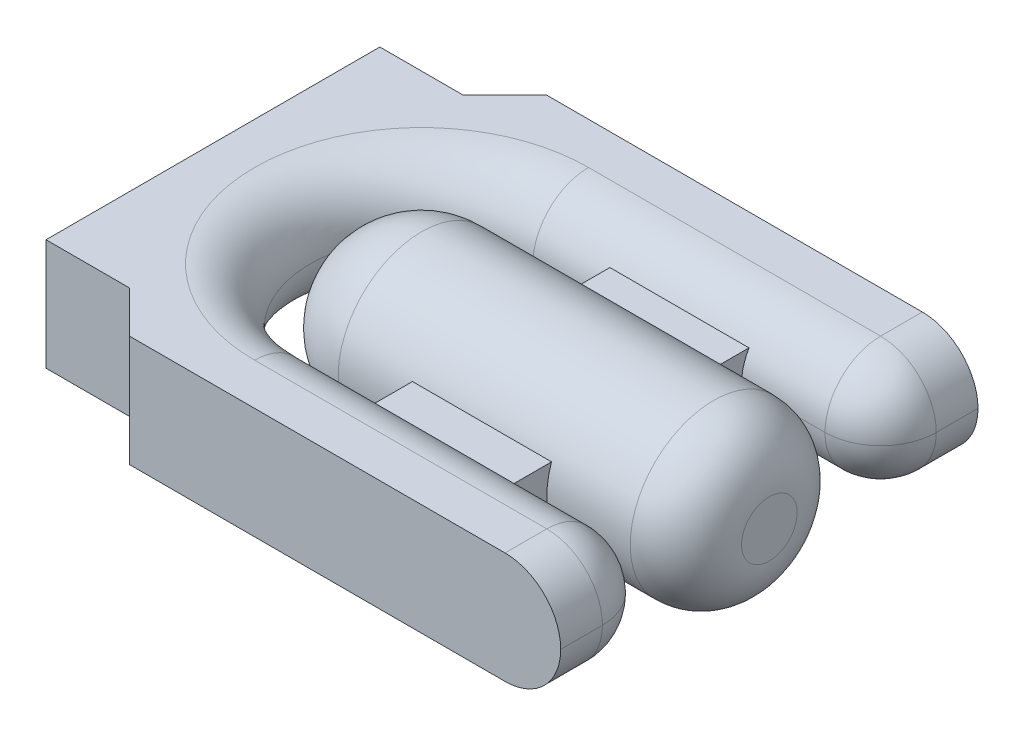
ISO-10303-21;
HEADER;
FILE_DESCRIPTION(('STEP AP214'),'2;1');
FILE_NAME('part.step','',(''),(''),'','','');
FILE_SCHEMA(('AUTOMOTIVE_DESIGN { 1 0 10303 214 1 1 1 1 }'));
ENDSEC;
DATA;
#1=APPLICATION_CONTEXT('core data for automotive mechanical design processes');
#2=APPLICATION_PROTOCOL_DEFINITION('international standard','automotive_design',2000,#1);
#3=PRODUCT_CONTEXT('',#1,'mechanical');
#4=PRODUCT('Part','Part','',(#3));
#5=PRODUCT_RELATED_PRODUCT_CATEGORY('part','',(#4));
#6=PRODUCT_DEFINITION_FORMATION('','',#4);
#7=PRODUCT_DEFINITION_CONTEXT('part definition',#1,'design');
#8=PRODUCT_DEFINITION('design','',#6,#7);
#9=PRODUCT_DEFINITION_SHAPE('','',#8);
#10=(LENGTH_UNIT() NAMED_UNIT(*) SI_UNIT(.MILLI.,.METRE.));
#11=(NAMED_UNIT(*) PLANE_ANGLE_UNIT() SI_UNIT($,.RADIAN.));
#12=(NAMED_UNIT(*) SI_UNIT($,.STERADIAN.) SOLID_ANGLE_UNIT());
#13=UNCERTAINTY_MEASURE_WITH_UNIT(LENGTH_MEASURE(1.E-05),#10,'distance_accuracy_value','');
#14=(GEOMETRIC_REPRESENTATION_CONTEXT(3) GLOBAL_UNCERTAINTY_ASSIGNED_CONTEXT((#13)) GLOBAL_UNIT_ASSIGNED_CONTEXT((#10,
#11,#12)) REPRESENTATION_CONTEXT('',''));
#15=CARTESIAN_POINT('',(0.,0.,0.));
#16=DIRECTION('',(0.,0.,1.));
#17=DIRECTION('',(1.,0.,0.));
#18=AXIS2_PLACEMENT_3D('',#15,#16,#17);
#19=CARTESIAN_POINT('',(0.,-20.,60.));
#20=DIRECTION('',(0.,0.,1.));
#21=DIRECTION('',(1.,0.,0.));
#22=AXIS2_PLACEMENT_3D('',#19,#20,#21);
#23=PLANE('',#22);
#24=DIRECTION('',(0.,1.,0.));
#25=VECTOR('',#24,1.);
#26=CARTESIAN_POINT('',(30.,-20.,60.));
#27=LINE('',#26,#25);
#28=CARTESIAN_POINT('',(30.,-20.,60.));
#29=VERTEX_POINT('',#28);
#30=CARTESIAN_POINT('',(30.,20.,60.));
#31=VERTEX_POINT('',#30);
#32=EDGE_CURVE('E389',#29,#31,#27,.T.);
#33=ORIENTED_EDGE('',*,*,#32,.T.);
#34=DIRECTION('',(1.,0.,0.));
#35=VECTOR('',#34,1.);
#36=CARTESIAN_POINT('',(0.,20.,60.));
#37=LINE('',#36,#35);
#38=CARTESIAN_POINT('',(0.,20.,60.));
#39=VERTEX_POINT('',#38);
#40=EDGE_CURVE('E339',#39,#31,#37,.T.);
#41=ORIENTED_EDGE('',*,*,#40,.F.);
#42=DIRECTION('',(0.,1.,0.));
#43=VECTOR('',#42,1.);
#44=CARTESIAN_POINT('',(0.,-20.,60.));
#45=LINE('',#44,#43);
#46=CARTESIAN_POINT('',(0.,-20.,60.));
#47=VERTEX_POINT('',#46);
#48=EDGE_CURVE('E390',#47,#39,#45,.T.);
#49=ORIENTED_EDGE('',*,*,#48,.F.);
#50=DIRECTION('',(1.,0.,0.));
#51=VECTOR('',#50,1.);
#52=CARTESIAN_POINT('',(0.,-20.,60.));
#53=LINE('',#52,#51);
#54=EDGE_CURVE('E369',#47,#29,#53,.T.);
#55=ORIENTED_EDGE('',*,*,#54,.T.);
#56=EDGE_LOOP('',(#33,#41,#49,#55));
#57=FACE_BOUND('',#56,.T.);
#58=ADVANCED_FACE('F37',(#57),#23,.T.);
#59=CARTESIAN_POINT('',(0.,-20.,-60.));
#60=DIRECTION('',(-1.,0.,0.));
#61=DIRECTION('',(0.,0.,1.));
#62=AXIS2_PLACEMENT_3D('',#59,#60,#61);
#63=PLANE('',#62);
#64=ORIENTED_EDGE('',*,*,#48,.T.);
#65=DIRECTION('',(0.,0.,1.));
#66=VECTOR('',#65,1.);
#67=CARTESIAN_POINT('',(0.,20.,-60.));
#68=LINE('',#67,#66);
#69=CARTESIAN_POINT('',(0.,20.,-60.));
#70=VERTEX_POINT('',#69);
#71=EDGE_CURVE('E366',#70,#39,#68,.T.);
#72=ORIENTED_EDGE('',*,*,#71,.F.);
#73=DIRECTION('',(0.,1.,0.));
#74=VECTOR('',#73,1.);
#75=CARTESIAN_POINT('',(0.,-20.,-60.));
#76=LINE('',#75,#74);
#77=CARTESIAN_POINT('',(0.,-20.,-60.));
#78=VERTEX_POINT('',#77);
#79=EDGE_CURVE('E393',#78,#70,#76,.T.);
#80=ORIENTED_EDGE('',*,*,#79,.F.);
#81=DIRECTION('',(0.,0.,1.));
#82=VECTOR('',#81,1.);
#83=CARTESIAN_POINT('',(0.,-20.,-60.));
#84=LINE('',#83,#82);
#85=EDGE_CURVE('E386',#78,#47,#84,.T.);
#86=ORIENTED_EDGE('',*,*,#85,.T.);
#87=EDGE_LOOP('',(#64,#72,#80,#86));
#88=FACE_BOUND('',#87,.T.);
#89=ADVANCED_FACE('F498',(#88),#63,.T.);
#90=CARTESIAN_POINT('',(0.,-20.,-60.));
#91=DIRECTION('',(0.,0.,-1.));
#92=DIRECTION('',(-1.,0.,0.));
#93=AXIS2_PLACEMENT_3D('',#90,#91,#92);
#94=PLANE('',#93);
#95=ORIENTED_EDGE('',*,*,#79,.T.);
#96=DIRECTION('',(-1.,0.,0.));
#97=VECTOR('',#96,1.);
#98=CARTESIAN_POINT('',(0.,20.,-60.));
#99=LINE('',#98,#97);
#100=CARTESIAN_POINT('',(30.,20.,-60.));
#101=VERTEX_POINT('',#100);
#102=EDGE_CURVE('E363',#101,#70,#99,.T.);
#103=ORIENTED_EDGE('',*,*,#102,.F.);
#104=DIRECTION('',(0.,1.,0.));
#105=VECTOR('',#104,1.);
#106=CARTESIAN_POINT('',(30.,-20.,-60.));
#107=LINE('',#106,#105);
#108=CARTESIAN_POINT('',(30.,-20.,-60.));
#109=VERTEX_POINT('',#108);
#110=EDGE_CURVE('E395',#109,#101,#107,.T.);
#111=ORIENTED_EDGE('',*,*,#110,.F.);
#112=DIRECTION('',(-1.,0.,0.));
#113=VECTOR('',#112,1.);
#114=CARTESIAN_POINT('',(0.,-20.,-60.));
#115=LINE('',#114,#113);
#116=EDGE_CURVE('E383',#109,#78,#115,.T.);
#117=ORIENTED_EDGE('',*,*,#116,.T.);
#118=EDGE_LOOP('',(#95,#103,#111,#117));
#119=FACE_BOUND('',#118,.T.);
#120=ADVANCED_FACE('F504',(#119),#94,.T.);
#121=CARTESIAN_POINT('',(30.,-20.,-60.));
#122=DIRECTION('',(-0.707106781186547,0.,-0.707106781186548));
#123=DIRECTION('',(-0.707106781186548,0.,0.707106781186547));
#124=AXIS2_PLACEMENT_3D('',#121,#122,#123);
#125=PLANE('',#124);
#126=ORIENTED_EDGE('',*,*,#110,.T.);
#127=DIRECTION('',(-0.707106781186548,0.,0.707106781186547));
#128=VECTOR('',#127,1.);
#129=CARTESIAN_POINT('',(30.,20.,-60.));
#130=LINE('',#129,#128);
#131=CARTESIAN_POINT('',(45.,20.,-75.));
#132=VERTEX_POINT('',#131);
#133=EDGE_CURVE('E360',#132,#101,#130,.T.);
#134=ORIENTED_EDGE('',*,*,#133,.F.);
#135=DIRECTION('',(0.,1.,0.));
#136=VECTOR('',#135,1.);
#137=CARTESIAN_POINT('',(45.,-20.,-75.));
#138=LINE('',#137,#136);
#139=CARTESIAN_POINT('',(45.,-20.,-75.));
#140=VERTEX_POINT('',#139);
#141=EDGE_CURVE('E397',#140,#132,#138,.T.);
#142=ORIENTED_EDGE('',*,*,#141,.F.);
#143=DIRECTION('',(-0.707106781186548,0.,0.707106781186547));
#144=VECTOR('',#143,1.);
#145=CARTESIAN_POINT('',(30.,-20.,-60.));
#146=LINE('',#145,#144);
#147=EDGE_CURVE('E380',#140,#109,#146,.T.);
#148=ORIENTED_EDGE('',*,*,#147,.T.);
#149=EDGE_LOOP('',(#126,#134,#142,#148));
#150=FACE_BOUND('',#149,.T.);
#151=ADVANCED_FACE('F559',(#150),#125,.T.);
#152=CARTESIAN_POINT('',(45.,-20.,-75.));
#153=DIRECTION('',(0.,0.,-1.));
#154=DIRECTION('',(-1.,0.,0.));
#155=AXIS2_PLACEMENT_3D('',#152,#153,#154);
#156=PLANE('',#155);
#157=CARTESIAN_POINT('',(180.,0.,-75.));
#158=DIRECTION('',(0.,0.,-1.));
#159=DIRECTION('',(-1.,0.,0.));
#160=AXIS2_PLACEMENT_3D('',#157,#158,#159);
#161=CIRCLE('',#160,20.);
#162=CARTESIAN_POINT('',(180.,20.,-75.));
#163=VERTEX_POINT('',#162);
#164=CARTESIAN_POINT('',(200.,0.,-75.));
#165=VERTEX_POINT('',#164);
#166=EDGE_CURVE('E417',#163,#165,#161,.T.);
#167=ORIENTED_EDGE('',*,*,#166,.T.);
#168=CARTESIAN_POINT('',(180.,0.,-75.));
#169=DIRECTION('',(0.,0.,-1.));
#170=DIRECTION('',(-1.,0.,0.));
#171=AXIS2_PLACEMENT_3D('',#168,#169,#170);
#172=CIRCLE('',#171,20.);
#173=CARTESIAN_POINT('',(180.,-20.,-75.));
#174=VERTEX_POINT('',#173);
#175=EDGE_CURVE('E419',#165,#174,#172,.T.);
#176=ORIENTED_EDGE('',*,*,#175,.T.);
#177=DIRECTION('',(-1.,0.,0.));
#178=VECTOR('',#177,1.);
#179=CARTESIAN_POINT('',(45.,-20.,-75.));
#180=LINE('',#179,#178);
#181=EDGE_CURVE('E378',#174,#140,#180,.T.);
#182=ORIENTED_EDGE('',*,*,#181,.T.);
#183=ORIENTED_EDGE('',*,*,#141,.T.);
#184=DIRECTION('',(-1.,0.,0.));
#185=VECTOR('',#184,1.);
#186=CARTESIAN_POINT('',(45.,20.,-75.));
#187=LINE('',#186,#185);
#188=EDGE_CURVE('E358',#163,#132,#187,.T.);
#189=ORIENTED_EDGE('',*,*,#188,.F.);
#190=EDGE_LOOP('',(#167,#176,#182,#183,#189));
#191=FACE_BOUND('',#190,.T.);
#192=ADVANCED_FACE('F555',(#191),#156,.T.);
#193=CARTESIAN_POINT('',(45.,-20.,75.));
#194=DIRECTION('',(0.,0.,1.));
#195=DIRECTION('',(1.,0.,0.));
#196=AXIS2_PLACEMENT_3D('',#193,#194,#195);
#197=PLANE('',#196);
#198=DIRECTION('',(1.,0.,0.));
#199=VECTOR('',#198,1.);
#200=CARTESIAN_POINT('',(45.,-20.,75.));
#201=LINE('',#200,#199);
#202=CARTESIAN_POINT('',(45.,-20.,75.));
#203=VERTEX_POINT('',#202);
#204=CARTESIAN_POINT('',(180.,-20.,75.));
#205=VERTEX_POINT('',#204);
#206=EDGE_CURVE('E375',#203,#205,#201,.T.);
#207=ORIENTED_EDGE('',*,*,#206,.T.);
#208=CARTESIAN_POINT('',(180.,0.,75.));
#209=DIRECTION('',(0.,0.,1.));
#210=DIRECTION('',(1.,0.,0.));
#211=AXIS2_PLACEMENT_3D('',#208,#209,#210);
#212=CIRCLE('',#211,20.);
#213=CARTESIAN_POINT('',(200.,0.,75.));
#214=VERTEX_POINT('',#213);
#215=EDGE_CURVE('E415',#205,#214,#212,.T.);
#216=ORIENTED_EDGE('',*,*,#215,.T.);
#217=CARTESIAN_POINT('',(180.,0.,75.));
#218=DIRECTION('',(0.,0.,1.));
#219=DIRECTION('',(1.,0.,0.));
#220=AXIS2_PLACEMENT_3D('',#217,#218,#219);
#221=CIRCLE('',#220,20.);
#222=CARTESIAN_POINT('',(180.,20.,75.));
#223=VERTEX_POINT('',#222);
#224=EDGE_CURVE('E413',#214,#223,#221,.T.);
#225=ORIENTED_EDGE('',*,*,#224,.T.);
#226=DIRECTION('',(1.,0.,0.));
#227=VECTOR('',#226,1.);
#228=CARTESIAN_POINT('',(45.,20.,75.));
#229=LINE('',#228,#227);
#230=CARTESIAN_POINT('',(45.,20.,75.));
#231=VERTEX_POINT('',#230);
#232=EDGE_CURVE('E355',#231,#223,#229,.T.);
#233=ORIENTED_EDGE('',*,*,#232,.F.);
#234=DIRECTION('',(0.,1.,0.));
#235=VECTOR('',#234,1.);
#236=CARTESIAN_POINT('',(45.,-20.,75.));
#237=LINE('',#236,#235);
#238=EDGE_CURVE('E400',#203,#231,#237,.T.);
#239=ORIENTED_EDGE('',*,*,#238,.F.);
#240=EDGE_LOOP('',(#207,#216,#225,#233,#239));
#241=FACE_BOUND('',#240,.T.);
#242=ADVANCED_FACE('F572',(#241),#197,.T.);
#243=CARTESIAN_POINT('',(30.,-20.,60.));
#244=DIRECTION('',(-0.707106781186548,0.,0.707106781186548));
#245=DIRECTION('',(0.707106781186548,0.,0.707106781186548));
#246=AXIS2_PLACEMENT_3D('',#243,#244,#245);
#247=PLANE('',#246);
#248=ORIENTED_EDGE('',*,*,#238,.T.);
#249=DIRECTION('',(0.707106781186547,0.,0.707106781186547));
#250=VECTOR('',#249,1.);
#251=CARTESIAN_POINT('',(30.,20.,60.));
#252=LINE('',#251,#250);
#253=EDGE_CURVE('E352',#31,#231,#252,.T.);
#254=ORIENTED_EDGE('',*,*,#253,.F.);
#255=ORIENTED_EDGE('',*,*,#32,.F.);
#256=DIRECTION('',(0.707106781186547,0.,0.707106781186547));
#257=VECTOR('',#256,1.);
#258=CARTESIAN_POINT('',(30.,-20.,60.));
#259=LINE('',#258,#257);
#260=EDGE_CURVE('E372',#29,#203,#259,.T.);
#261=ORIENTED_EDGE('',*,*,#260,.T.);
#262=EDGE_LOOP('',(#248,#254,#255,#261));
#263=FACE_BOUND('',#262,.T.);
#264=ADVANCED_FACE('F509',(#263),#247,.T.);
#265=CARTESIAN_POINT('',(180.,-20.,60.));
#266=DIRECTION('',(0.,1.,0.));
#267=DIRECTION('',(0.,0.,1.));
#268=AXIS2_PLACEMENT_3D('',#265,#266,#267);
#269=PLANE('',#268);
#270=DIRECTION('',(-1.,0.,0.));
#271=VECTOR('',#270,1.);
#272=CARTESIAN_POINT('',(180.,-20.,60.));
#273=LINE('',#272,#271);
#274=CARTESIAN_POINT('',(75.0000000000003,-20.,60.));
#275=VERTEX_POINT('',#274);
#276=CARTESIAN_POINT('',(180.,-20.,60.));
#277=VERTEX_POINT('',#276);
#278=EDGE_CURVE('E408',#275,#277,#273,.F.);
#279=ORIENTED_EDGE('',*,*,#278,.T.);
#280=DIRECTION('',(0.,0.,-1.));
#281=VECTOR('',#280,1.);
#282=CARTESIAN_POINT('',(180.,-20.,75.));
#283=LINE('',#282,#281);
#284=EDGE_CURVE('E410',#277,#205,#283,.F.);
#285=ORIENTED_EDGE('',*,*,#284,.T.);
#286=ORIENTED_EDGE('',*,*,#206,.F.);
#287=ORIENTED_EDGE('',*,*,#260,.F.);
#288=ORIENTED_EDGE('',*,*,#54,.F.);
#289=ORIENTED_EDGE('',*,*,#85,.F.);
#290=ORIENTED_EDGE('',*,*,#116,.F.);
#291=ORIENTED_EDGE('',*,*,#147,.F.);
#292=ORIENTED_EDGE('',*,*,#181,.F.);
#293=DIRECTION('',(0.,0.,-1.));
#294=VECTOR('',#293,1.);
#295=CARTESIAN_POINT('',(180.,-20.,-60.0000000000001));
#296=LINE('',#295,#294);
#297=CARTESIAN_POINT('',(180.,-20.,-60.));
#298=VERTEX_POINT('',#297);
#299=EDGE_CURVE('E406',#174,#298,#296,.F.);
#300=ORIENTED_EDGE('',*,*,#299,.T.);
#301=DIRECTION('',(1.,0.,0.));
#302=VECTOR('',#301,1.);
#303=CARTESIAN_POINT('',(75.0000000000003,-20.,-60.));
#304=LINE('',#303,#302);
#305=CARTESIAN_POINT('',(75.0000000000003,-20.,-60.));
#306=VERTEX_POINT('',#305);
#307=EDGE_CURVE('E404',#298,#306,#304,.F.);
#308=ORIENTED_EDGE('',*,*,#307,.T.);
#309=CARTESIAN_POINT('',(75.,-20.,0.));
#310=DIRECTION('',(0.,1.,0.));
#311=DIRECTION('',(0.,0.,1.));
#312=AXIS2_PLACEMENT_3D('',#309,#310,#311);
#313=CIRCLE('',#312,60.);
#314=EDGE_CURVE('E392',#306,#275,#313,.T.);
#315=ORIENTED_EDGE('',*,*,#314,.T.);
#316=EDGE_LOOP('',(#279,#285,#286,#287,#288,#289,#290,#291,#292,#300,#308,#315));
#317=FACE_BOUND('',#316,.T.);
#318=ADVANCED_FACE('F550',(#317),#269,.F.);
#319=CARTESIAN_POINT('',(180.,20.,60.));
#320=DIRECTION('',(0.,1.,0.));
#321=DIRECTION('',(0.,0.,1.));
#322=AXIS2_PLACEMENT_3D('',#319,#320,#321);
#323=PLANE('',#322);
#324=ORIENTED_EDGE('',*,*,#232,.T.);
#325=DIRECTION('',(0.,0.,-1.));
#326=VECTOR('',#325,1.);
#327=CARTESIAN_POINT('',(180.,20.,60.));
#328=LINE('',#327,#326);
#329=CARTESIAN_POINT('',(180.,20.,60.));
#330=VERTEX_POINT('',#329);
#331=EDGE_CURVE('E429',#223,#330,#328,.T.);
#332=ORIENTED_EDGE('',*,*,#331,.T.);
#333=DIRECTION('',(-1.,0.,0.));
#334=VECTOR('',#333,1.);
#335=CARTESIAN_POINT('',(180.,20.,60.));
#336=LINE('',#335,#334);
#337=CARTESIAN_POINT('',(75.0000000000003,20.,60.));
#338=VERTEX_POINT('',#337);
#339=EDGE_CURVE('E427',#330,#338,#336,.T.);
#340=ORIENTED_EDGE('',*,*,#339,.T.);
#341=CARTESIAN_POINT('',(75.,20.,0.));
#342=DIRECTION('',(0.,1.,0.));
#343=DIRECTION('',(0.,0.,1.));
#344=AXIS2_PLACEMENT_3D('',#341,#342,#343);
#345=CIRCLE('',#344,60.);
#346=CARTESIAN_POINT('',(75.0000000000003,20.,-60.));
#347=VERTEX_POINT('',#346);
#348=EDGE_CURVE('E421',#338,#347,#345,.F.);
#349=ORIENTED_EDGE('',*,*,#348,.T.);
#350=DIRECTION('',(1.,0.,0.));
#351=VECTOR('',#350,1.);
#352=CARTESIAN_POINT('',(180.,20.,-60.));
#353=LINE('',#352,#351);
#354=CARTESIAN_POINT('',(180.,20.,-60.));
#355=VERTEX_POINT('',#354);
#356=EDGE_CURVE('E423',#347,#355,#353,.T.);
#357=ORIENTED_EDGE('',*,*,#356,.T.);
#358=DIRECTION('',(0.,0.,-1.));
#359=VECTOR('',#358,1.);
#360=CARTESIAN_POINT('',(180.,20.,60.));
#361=LINE('',#360,#359);
#362=EDGE_CURVE('E425',#355,#163,#361,.T.);
#363=ORIENTED_EDGE('',*,*,#362,.T.);
#364=ORIENTED_EDGE('',*,*,#188,.T.);
#365=ORIENTED_EDGE('',*,*,#133,.T.);
#366=ORIENTED_EDGE('',*,*,#102,.T.);
#367=ORIENTED_EDGE('',*,*,#71,.T.);
#368=ORIENTED_EDGE('',*,*,#40,.T.);
#369=ORIENTED_EDGE('',*,*,#253,.T.);
#370=EDGE_LOOP('',(#324,#332,#340,#349,#357,#363,#364,#365,#366,#367,#368,#369));
#371=FACE_BOUND('',#370,.T.);
#372=ADVANCED_FACE('F561',(#371),#323,.T.);
#373=CARTESIAN_POINT('',(150.,-9.99999999999999,500000.));
#374=DIRECTION('',(-1.,0.,0.));
#375=DIRECTION('',(0.,0.,1.));
#376=AXIS2_PLACEMENT_3D('',#373,#374,#375);
#377=PLANE('',#376);
#378=CARTESIAN_POINT('',(150.,0.,0.));
#379=DIRECTION('',(-1.,0.,0.));
#380=DIRECTION('',(0.,0.,1.));
#381=AXIS2_PLACEMENT_3D('',#378,#379,#380);
#382=CIRCLE('',#381,30.);
#383=CARTESIAN_POINT('',(150.,-9.99999999999999,-28.2842712474576));
#384=VERTEX_POINT('',#383);
#385=CARTESIAN_POINT('',(150.,10.,-28.2842712474576));
#386=VERTEX_POINT('',#385);
#387=EDGE_CURVE('E333',#384,#386,#382,.F.);
#388=ORIENTED_EDGE('',*,*,#387,.F.);
#389=DIRECTION('',(0.,0.,-1.));
#390=VECTOR('',#389,1.);
#391=CARTESIAN_POINT('',(150.,-9.99999999999999,500000.));
#392=LINE('',#391,#390);
#393=CARTESIAN_POINT('',(150.,-9.99999999999999,-42.6794919243321));
#394=VERTEX_POINT('',#393);
#395=EDGE_CURVE('E337',#384,#394,#392,.T.);
#396=ORIENTED_EDGE('',*,*,#395,.T.);
#397=CARTESIAN_POINT('',(150.,0.,-60.));
#398=DIRECTION('',(-1.,0.,0.));
#399=DIRECTION('',(0.,0.,1.));
#400=AXIS2_PLACEMENT_3D('',#397,#398,#399);
#401=CIRCLE('',#400,20.);
#402=CARTESIAN_POINT('',(150.,0.,-40.));
#403=VERTEX_POINT('',#402);
#404=EDGE_CURVE('E444',#394,#403,#401,.T.);
#405=ORIENTED_EDGE('',*,*,#404,.T.);
#406=CARTESIAN_POINT('',(150.,0.,-60.));
#407=DIRECTION('',(-1.,0.,0.));
#408=DIRECTION('',(0.,0.,1.));
#409=AXIS2_PLACEMENT_3D('',#406,#407,#408);
#410=CIRCLE('',#409,20.);
#411=CARTESIAN_POINT('',(150.,10.,-42.6794919243321));
#412=VERTEX_POINT('',#411);
#413=EDGE_CURVE('E248',#403,#412,#410,.T.);
#414=ORIENTED_EDGE('',*,*,#413,.T.);
#415=DIRECTION('',(0.,0.,-1.));
#416=VECTOR('',#415,1.);
#417=CARTESIAN_POINT('',(150.,10.,500000.));
#418=LINE('',#417,#416);
#419=EDGE_CURVE('E331',#386,#412,#418,.T.);
#420=ORIENTED_EDGE('',*,*,#419,.F.);
#421=EDGE_LOOP('',(#388,#396,#405,#414,#420));
#422=FACE_BOUND('',#421,.T.);
#423=ADVANCED_FACE('F589',(#422),#377,.F.);
#424=CARTESIAN_POINT('',(100.,10.,500000.));
#425=DIRECTION('',(0.,-1.,0.));
#426=DIRECTION('',(0.,0.,-1.));
#427=AXIS2_PLACEMENT_3D('',#424,#425,#426);
#428=PLANE('',#427);
#429=DIRECTION('',(-1.,0.,0.));
#430=VECTOR('',#429,1.);
#431=CARTESIAN_POINT('',(45.,10.,-28.2842712474619));
#432=LINE('',#431,#430);
#433=CARTESIAN_POINT('',(100.,10.,-28.2842712474619));
#434=VERTEX_POINT('',#433);
#435=EDGE_CURVE('E342',#386,#434,#432,.T.);
#436=ORIENTED_EDGE('',*,*,#435,.F.);
#437=ORIENTED_EDGE('',*,*,#419,.T.);
#438=DIRECTION('',(1.,0.,0.));
#439=VECTOR('',#438,1.);
#440=CARTESIAN_POINT('',(150.,10.,-42.6794919243112));
#441=LINE('',#440,#439);
#442=CARTESIAN_POINT('',(100.,10.,-42.6794919243321));
#443=VERTEX_POINT('',#442);
#444=EDGE_CURVE('E47',#412,#443,#441,.F.);
#445=ORIENTED_EDGE('',*,*,#444,.T.);
#446=DIRECTION('',(0.,0.,-1.));
#447=VECTOR('',#446,1.);
#448=CARTESIAN_POINT('',(100.,10.,500000.));
#449=LINE('',#448,#447);
#450=EDGE_CURVE('E55',#434,#443,#449,.T.);
#451=ORIENTED_EDGE('',*,*,#450,.F.);
#452=EDGE_LOOP('',(#436,#437,#445,#451));
#453=FACE_BOUND('',#452,.T.);
#454=ADVANCED_FACE('F594',(#453),#428,.F.);
#455=CARTESIAN_POINT('',(100.,-9.99999999999999,500000.));
#456=DIRECTION('',(0.,1.,0.));
#457=DIRECTION('',(0.,0.,1.));
#458=AXIS2_PLACEMENT_3D('',#455,#456,#457);
#459=PLANE('',#458);
#460=DIRECTION('',(-1.,0.,0.));
#461=VECTOR('',#460,1.);
#462=CARTESIAN_POINT('',(45.,-9.99999999999999,-28.2842712474619));
#463=LINE('',#462,#461);
#464=CARTESIAN_POINT('',(100.,-10.0000000000014,-28.2842712474614));
#465=VERTEX_POINT('',#464);
#466=EDGE_CURVE('E330',#465,#384,#463,.F.);
#467=ORIENTED_EDGE('',*,*,#466,.F.);
#468=DIRECTION('',(0.,0.,-1.));
#469=VECTOR('',#468,1.);
#470=CARTESIAN_POINT('',(100.,-9.99999999999999,500000.));
#471=LINE('',#470,#469);
#472=CARTESIAN_POINT('',(100.,-9.99999999999999,-42.6794919243321));
#473=VERTEX_POINT('',#472);
#474=EDGE_CURVE('E335',#465,#473,#471,.T.);
#475=ORIENTED_EDGE('',*,*,#474,.T.);
#476=DIRECTION('',(-1.,0.,0.));
#477=VECTOR('',#476,1.);
#478=CARTESIAN_POINT('',(100.,-9.99999999999999,-42.6794919243112));
#479=LINE('',#478,#477);
#480=EDGE_CURVE('E441',#473,#394,#479,.F.);
#481=ORIENTED_EDGE('',*,*,#480,.T.);
#482=ORIENTED_EDGE('',*,*,#395,.F.);
#483=EDGE_LOOP('',(#467,#475,#481,#482));
#484=FACE_BOUND('',#483,.T.);
#485=ADVANCED_FACE('F591',(#484),#459,.F.);
#486=CARTESIAN_POINT('',(100.,-9.99999999999999,500000.));
#487=DIRECTION('',(1.,0.,0.));
#488=DIRECTION('',(0.,0.,-1.));
#489=AXIS2_PLACEMENT_3D('',#486,#487,#488);
#490=PLANE('',#489);
#491=CARTESIAN_POINT('',(100.,0.,0.));
#492=DIRECTION('',(1.,0.,0.));
#493=DIRECTION('',(0.,0.,-1.));
#494=AXIS2_PLACEMENT_3D('',#491,#492,#493);
#495=CIRCLE('',#494,30.);
#496=EDGE_CURVE('E345',#434,#465,#495,.F.);
#497=ORIENTED_EDGE('',*,*,#496,.F.);
#498=ORIENTED_EDGE('',*,*,#450,.T.);
#499=CARTESIAN_POINT('',(100.,0.,-60.));
#500=DIRECTION('',(1.,0.,0.));
#501=DIRECTION('',(0.,0.,-1.));
#502=AXIS2_PLACEMENT_3D('',#499,#500,#501);
#503=CIRCLE('',#502,20.);
#504=CARTESIAN_POINT('',(100.,0.,-40.));
#505=VERTEX_POINT('',#504);
#506=EDGE_CURVE('E11',#443,#505,#503,.T.);
#507=ORIENTED_EDGE('',*,*,#506,.T.);
#508=CARTESIAN_POINT('',(100.,0.,-60.));
#509=DIRECTION('',(1.,0.,0.));
#510=DIRECTION('',(0.,0.,-1.));
#511=AXIS2_PLACEMENT_3D('',#508,#509,#510);
#512=CIRCLE('',#511,20.);
#513=EDGE_CURVE('E438',#505,#473,#512,.T.);
#514=ORIENTED_EDGE('',*,*,#513,.T.);
#515=ORIENTED_EDGE('',*,*,#474,.F.);
#516=EDGE_LOOP('',(#497,#498,#507,#514,#515));
#517=FACE_BOUND('',#516,.T.);
#518=ADVANCED_FACE('F590',(#517),#490,.F.);
#519=CARTESIAN_POINT('',(45.,0.,0.));
#520=DIRECTION('',(-1.,0.,0.));
#521=DIRECTION('',(0.,-1.,0.));
#522=AXIS2_PLACEMENT_3D('',#519,#520,#521);
#523=CYLINDRICAL_SURFACE('',#522,30.);
#524=CARTESIAN_POINT('',(100.,0.,0.));
#525=DIRECTION('',(-1.,0.,0.));
#526=DIRECTION('',(0.,0.,1.));
#527=AXIS2_PLACEMENT_3D('',#524,#525,#526);
#528=CIRCLE('',#527,30.);
#529=CARTESIAN_POINT('',(100.,10.,28.2842712474576));
#530=VERTEX_POINT('',#529);
#531=CARTESIAN_POINT('',(100.,-9.99999999999999,28.2842712474619));
#532=VERTEX_POINT('',#531);
#533=EDGE_CURVE('E310',#530,#532,#528,.F.);
#534=ORIENTED_EDGE('',*,*,#533,.F.);
#535=DIRECTION('',(-1.,0.,0.));
#536=VECTOR('',#535,1.);
#537=CARTESIAN_POINT('',(45.,10.,28.2842712474619));
#538=LINE('',#537,#536);
#539=CARTESIAN_POINT('',(150.,10.,28.2842712474576));
#540=VERTEX_POINT('',#539);
#541=EDGE_CURVE('E315',#540,#530,#538,.T.);
#542=ORIENTED_EDGE('',*,*,#541,.F.);
#543=CARTESIAN_POINT('',(150.,0.,0.));
#544=DIRECTION('',(1.,0.,0.));
#545=DIRECTION('',(0.,0.,-1.));
#546=AXIS2_PLACEMENT_3D('',#543,#544,#545);
#547=CIRCLE('',#546,30.);
#548=CARTESIAN_POINT('',(150.,-9.99999999999999,28.2842712474576));
#549=VERTEX_POINT('',#548);
#550=EDGE_CURVE('E228',#549,#540,#547,.F.);
#551=ORIENTED_EDGE('',*,*,#550,.F.);
#552=DIRECTION('',(-1.,0.,0.));
#553=VECTOR('',#552,1.);
#554=CARTESIAN_POINT('',(45.,-9.99999999999999,28.2842712474619));
#555=LINE('',#554,#553);
#556=EDGE_CURVE('E94',#532,#549,#555,.F.);
#557=ORIENTED_EDGE('',*,*,#556,.F.);
#558=EDGE_LOOP('',(#534,#542,#551,#557));
#559=FACE_BOUND('',#558,.T.);
#560=CARTESIAN_POINT('',(75.,0.,0.));
#561=DIRECTION('',(-1.,0.,0.));
#562=DIRECTION('',(0.,-1.,0.));
#563=AXIS2_PLACEMENT_3D('',#560,#561,#562);
#564=CIRCLE('',#563,30.);
#565=CARTESIAN_POINT('',(75.,-30.,0.));
#566=VERTEX_POINT('',#565);
#567=EDGE_CURVE('E231',#566,#566,#564,.T.);
#568=ORIENTED_EDGE('',*,*,#567,.F.);
#569=EDGE_LOOP('',(#568));
#570=FACE_BOUND('',#569,.T.);
#571=CARTESIAN_POINT('',(180.,0.,0.));
#572=DIRECTION('',(-1.,0.,0.));
#573=DIRECTION('',(0.,-1.,0.));
#574=AXIS2_PLACEMENT_3D('',#571,#572,#573);
#575=CIRCLE('',#574,30.);
#576=CARTESIAN_POINT('',(180.,-30.,0.));
#577=VERTEX_POINT('',#576);
#578=EDGE_CURVE('E324',#577,#577,#575,.T.);
#579=ORIENTED_EDGE('',*,*,#578,.T.);
#580=EDGE_LOOP('',(#579));
#581=FACE_BOUND('',#580,.T.);
#582=ORIENTED_EDGE('',*,*,#466,.T.);
#583=ORIENTED_EDGE('',*,*,#387,.T.);
#584=ORIENTED_EDGE('',*,*,#435,.T.);
#585=ORIENTED_EDGE('',*,*,#496,.T.);
#586=EDGE_LOOP('',(#582,#583,#584,#585));
#587=FACE_BOUND('',#586,.T.);
#588=ADVANCED_FACE('F481',(#559,#570,#581,#587),#523,.T.);
#589=CARTESIAN_POINT('',(75.,0.,0.));
#590=DIRECTION('',(-1.,0.,0.));
#591=DIRECTION('',(0.,1.,0.));
#592=AXIS2_PLACEMENT_3D('',#589,#590,#591);
#593=SPHERICAL_SURFACE('',#592,30.);
#594=ORIENTED_EDGE('',*,*,#567,.T.);
#595=EDGE_LOOP('',(#594));
#596=FACE_BOUND('',#595,.T.);
#597=ADVANCED_FACE('F604',(#596),#593,.T.);
#598=CARTESIAN_POINT('',(200.,9.99999999999986,0.));
#599=DIRECTION('',(-1.,0.,0.));
#600=DIRECTION('',(0.,-1.,0.));
#601=AXIS2_PLACEMENT_3D('',#598,#599,#600);
#602=PLANE('',#601);
#603=CARTESIAN_POINT('',(200.,0.,0.));
#604=DIRECTION('',(-1.,0.,0.));
#605=DIRECTION('',(0.,-1.,0.));
#606=AXIS2_PLACEMENT_3D('',#603,#604,#605);
#607=CIRCLE('',#606,9.99999999999986);
#608=CARTESIAN_POINT('',(200.,-9.99999999999986,0.));
#609=VERTEX_POINT('',#608);
#610=EDGE_CURVE('E327',#609,#609,#607,.T.);
#611=ORIENTED_EDGE('',*,*,#610,.F.);
#612=EDGE_LOOP('',(#611));
#613=FACE_BOUND('',#612,.T.);
#614=ADVANCED_FACE('F494',(#613),#602,.F.);
#615=CARTESIAN_POINT('',(180.,0.,0.));
#616=DIRECTION('',(-1.,0.,0.));
#617=DIRECTION('',(0.,-1.,0.));
#618=AXIS2_PLACEMENT_3D('',#615,#616,#617);
#619=DEGENERATE_TOROIDAL_SURFACE('',#618,10.,20.,.T.);
#620=ORIENTED_EDGE('',*,*,#578,.F.);
#621=EDGE_LOOP('',(#620));
#622=FACE_BOUND('',#621,.T.);
#623=ORIENTED_EDGE('',*,*,#610,.T.);
#624=EDGE_LOOP('',(#623));
#625=FACE_BOUND('',#624,.T.);
#626=ADVANCED_FACE('F486',(#622,#625),#619,.T.);
#627=CARTESIAN_POINT('',(100.,10.,-500000.));
#628=DIRECTION('',(0.,1.,0.));
#629=DIRECTION('',(0.,0.,1.));
#630=AXIS2_PLACEMENT_3D('',#627,#628,#629);
#631=PLANE('',#630);
#632=DIRECTION('',(0.,0.,1.));
#633=VECTOR('',#632,1.);
#634=CARTESIAN_POINT('',(150.,10.,-500000.));
#635=LINE('',#634,#633);
#636=CARTESIAN_POINT('',(150.,10.,42.6794919243321));
#637=VERTEX_POINT('',#636);
#638=EDGE_CURVE('E220',#540,#637,#635,.T.);
#639=ORIENTED_EDGE('',*,*,#638,.F.);
#640=ORIENTED_EDGE('',*,*,#541,.T.);
#641=DIRECTION('',(0.,0.,1.));
#642=VECTOR('',#641,1.);
#643=CARTESIAN_POINT('',(100.,10.,-500000.));
#644=LINE('',#643,#642);
#645=CARTESIAN_POINT('',(100.,10.,42.6794919243321));
#646=VERTEX_POINT('',#645);
#647=EDGE_CURVE('E232',#530,#646,#644,.T.);
#648=ORIENTED_EDGE('',*,*,#647,.T.);
#649=DIRECTION('',(-1.,0.,0.));
#650=VECTOR('',#649,1.);
#651=CARTESIAN_POINT('',(100.,10.,42.6794919243112));
#652=LINE('',#651,#650);
#653=EDGE_CURVE('E235',#646,#637,#652,.F.);
#654=ORIENTED_EDGE('',*,*,#653,.T.);
#655=EDGE_LOOP('',(#639,#640,#648,#654));
#656=FACE_BOUND('',#655,.T.);
#657=ADVANCED_FACE('F236',(#656),#631,.T.);
#658=CARTESIAN_POINT('',(150.,-9.99999999999999,-500000.));
#659=DIRECTION('',(1.,0.,0.));
#660=DIRECTION('',(0.,0.,-1.));
#661=AXIS2_PLACEMENT_3D('',#658,#659,#660);
#662=PLANE('',#661);
#663=DIRECTION('',(0.,0.,1.));
#664=VECTOR('',#663,1.);
#665=CARTESIAN_POINT('',(150.,-9.99999999999999,-500000.));
#666=LINE('',#665,#664);
#667=CARTESIAN_POINT('',(150.,-9.99999999999999,42.6794919243321));
#668=VERTEX_POINT('',#667);
#669=EDGE_CURVE('E317',#549,#668,#666,.T.);
#670=ORIENTED_EDGE('',*,*,#669,.F.);
#671=ORIENTED_EDGE('',*,*,#550,.T.);
#672=ORIENTED_EDGE('',*,*,#638,.T.);
#673=CARTESIAN_POINT('',(150.,0.,60.));
#674=DIRECTION('',(1.,0.,0.));
#675=DIRECTION('',(0.,0.,-1.));
#676=AXIS2_PLACEMENT_3D('',#673,#674,#675);
#677=CIRCLE('',#676,20.);
#678=CARTESIAN_POINT('',(150.,0.,40.));
#679=VERTEX_POINT('',#678);
#680=EDGE_CURVE('E225',#637,#679,#677,.F.);
#681=ORIENTED_EDGE('',*,*,#680,.T.);
#682=CARTESIAN_POINT('',(150.,0.,60.));
#683=DIRECTION('',(1.,0.,0.));
#684=DIRECTION('',(0.,0.,-1.));
#685=AXIS2_PLACEMENT_3D('',#682,#683,#684);
#686=CIRCLE('',#685,20.);
#687=EDGE_CURVE('E431',#679,#668,#686,.F.);
#688=ORIENTED_EDGE('',*,*,#687,.T.);
#689=EDGE_LOOP('',(#670,#671,#672,#681,#688));
#690=FACE_BOUND('',#689,.T.);
#691=ADVANCED_FACE('F222',(#690),#662,.T.);
#692=CARTESIAN_POINT('',(100.,-9.99999999999999,-500000.));
#693=DIRECTION('',(-1.,0.,0.));
#694=DIRECTION('',(0.,0.,1.));
#695=AXIS2_PLACEMENT_3D('',#692,#693,#694);
#696=PLANE('',#695);
#697=ORIENTED_EDGE('',*,*,#647,.F.);
#698=ORIENTED_EDGE('',*,*,#533,.T.);
#699=DIRECTION('',(0.,0.,1.));
#700=VECTOR('',#699,1.);
#701=CARTESIAN_POINT('',(100.,-9.99999999999999,-500000.));
#702=LINE('',#701,#700);
#703=CARTESIAN_POINT('',(100.,-9.99999999999999,42.6794919243321));
#704=VERTEX_POINT('',#703);
#705=EDGE_CURVE('E319',#532,#704,#702,.T.);
#706=ORIENTED_EDGE('',*,*,#705,.T.);
#707=CARTESIAN_POINT('',(100.,0.,60.));
#708=DIRECTION('',(-1.,0.,0.));
#709=DIRECTION('',(0.,0.,1.));
#710=AXIS2_PLACEMENT_3D('',#707,#708,#709);
#711=CIRCLE('',#710,20.);
#712=CARTESIAN_POINT('',(100.,0.,40.));
#713=VERTEX_POINT('',#712);
#714=EDGE_CURVE('E436',#704,#713,#711,.F.);
#715=ORIENTED_EDGE('',*,*,#714,.T.);
#716=CARTESIAN_POINT('',(100.,0.,60.));
#717=DIRECTION('',(-1.,0.,0.));
#718=DIRECTION('',(0.,0.,1.));
#719=AXIS2_PLACEMENT_3D('',#716,#717,#718);
#720=CIRCLE('',#719,20.);
#721=EDGE_CURVE('E241',#713,#646,#720,.F.);
#722=ORIENTED_EDGE('',*,*,#721,.T.);
#723=EDGE_LOOP('',(#697,#698,#706,#715,#722));
#724=FACE_BOUND('',#723,.T.);
#725=ADVANCED_FACE('F446',(#724),#696,.T.);
#726=CARTESIAN_POINT('',(100.,-9.99999999999999,-500000.));
#727=DIRECTION('',(0.,-1.,0.));
#728=DIRECTION('',(0.,0.,-1.));
#729=AXIS2_PLACEMENT_3D('',#726,#727,#728);
#730=PLANE('',#729);
#731=ORIENTED_EDGE('',*,*,#705,.F.);
#732=ORIENTED_EDGE('',*,*,#556,.T.);
#733=ORIENTED_EDGE('',*,*,#669,.T.);
#734=DIRECTION('',(1.,0.,0.));
#735=VECTOR('',#734,1.);
#736=CARTESIAN_POINT('',(150.,-9.99999999999999,42.6794919243112));
#737=LINE('',#736,#735);
#738=EDGE_CURVE('E433',#668,#704,#737,.F.);
#739=ORIENTED_EDGE('',*,*,#738,.T.);
#740=EDGE_LOOP('',(#731,#732,#733,#739));
#741=FACE_BOUND('',#740,.T.);
#742=ADVANCED_FACE('F483',(#741),#730,.T.);
#743=CARTESIAN_POINT('',(180.,0.,60.));
#744=DIRECTION('',(0.,0.,-1.));
#745=DIRECTION('',(-1.,0.,0.));
#746=AXIS2_PLACEMENT_3D('',#743,#744,#745);
#747=CYLINDRICAL_SURFACE('',#746,20.);
#748=CARTESIAN_POINT('',(180.,0.,-60.0000000000001));
#749=DIRECTION('',(0.,0.,1.));
#750=DIRECTION('',(1.,0.,0.));
#751=AXIS2_PLACEMENT_3D('',#748,#749,#750);
#752=CIRCLE('',#751,20.);
#753=CARTESIAN_POINT('',(200.,0.,-60.0000000000001));
#754=VERTEX_POINT('',#753);
#755=EDGE_CURVE('E41',#754,#355,#752,.T.);
#756=ORIENTED_EDGE('',*,*,#755,.F.);
#757=DIRECTION('',(0.,0.,-1.));
#758=VECTOR('',#757,1.);
#759=CARTESIAN_POINT('',(200.,0.,-75.));
#760=LINE('',#759,#758);
#761=EDGE_CURVE('E305',#165,#754,#760,.F.);
#762=ORIENTED_EDGE('',*,*,#761,.F.);
#763=ORIENTED_EDGE('',*,*,#166,.F.);
#764=ORIENTED_EDGE('',*,*,#362,.F.);
#765=EDGE_LOOP('',(#756,#762,#763,#764));
#766=FACE_BOUND('',#765,.T.);
#767=ADVANCED_FACE('F39',(#766),#747,.T.);
#768=CARTESIAN_POINT('',(180.,0.,-60.));
#769=DIRECTION('',(0.,1.,0.));
#770=DIRECTION('',(0.,0.,1.));
#771=AXIS2_PLACEMENT_3D('',#768,#769,#770);
#772=SPHERICAL_SURFACE('',#771,20.);
#773=CARTESIAN_POINT('',(180.,0.,-60.));
#774=DIRECTION('',(0.,1.,0.));
#775=DIRECTION('',(0.,0.,1.));
#776=AXIS2_PLACEMENT_3D('',#773,#774,#775);
#777=CIRCLE('',#776,20.);
#778=CARTESIAN_POINT('',(180.,0.,-40.));
#779=VERTEX_POINT('',#778);
#780=EDGE_CURVE('E303',#754,#779,#777,.F.);
#781=ORIENTED_EDGE('',*,*,#780,.F.);
#782=ORIENTED_EDGE('',*,*,#755,.T.);
#783=CARTESIAN_POINT('',(180.,0.,-60.));
#784=DIRECTION('',(-1.,0.,0.));
#785=DIRECTION('',(0.,0.,1.));
#786=AXIS2_PLACEMENT_3D('',#783,#784,#785);
#787=CIRCLE('',#786,20.);
#788=EDGE_CURVE('E79',#779,#355,#787,.T.);
#789=ORIENTED_EDGE('',*,*,#788,.F.);
#790=EDGE_LOOP('',(#781,#782,#789));
#791=FACE_BOUND('',#790,.T.);
#792=ADVANCED_FACE('F491',(#791),#772,.T.);
#793=CARTESIAN_POINT('',(180.,0.,-75.));
#794=DIRECTION('',(0.,0.,1.));
#795=DIRECTION('',(1.,0.,0.));
#796=AXIS2_PLACEMENT_3D('',#793,#794,#795);
#797=CYLINDRICAL_SURFACE('',#796,20.);
#798=ORIENTED_EDGE('',*,*,#175,.F.);
#799=ORIENTED_EDGE('',*,*,#761,.T.);
#800=CARTESIAN_POINT('',(180.,0.,-60.0000000000001));
#801=DIRECTION('',(0.,0.,1.));
#802=DIRECTION('',(1.,0.,0.));
#803=AXIS2_PLACEMENT_3D('',#800,#801,#802);
#804=CIRCLE('',#803,20.);
#805=EDGE_CURVE('E300',#298,#754,#804,.T.);
#806=ORIENTED_EDGE('',*,*,#805,.F.);
#807=ORIENTED_EDGE('',*,*,#299,.F.);
#808=EDGE_LOOP('',(#798,#799,#806,#807));
#809=FACE_BOUND('',#808,.T.);
#810=ADVANCED_FACE('F538',(#809),#797,.T.);
#811=CARTESIAN_POINT('',(180.,0.,-60.));
#812=DIRECTION('',(1.,0.,0.));
#813=DIRECTION('',(0.,0.,-1.));
#814=AXIS2_PLACEMENT_3D('',#811,#812,#813);
#815=CYLINDRICAL_SURFACE('',#814,20.);
#816=ORIENTED_EDGE('',*,*,#788,.T.);
#817=ORIENTED_EDGE('',*,*,#356,.F.);
#818=CARTESIAN_POINT('',(75.0000000000003,0.,-60.));
#819=DIRECTION('',(-1.,0.,0.));
#820=DIRECTION('',(0.,0.,1.));
#821=AXIS2_PLACEMENT_3D('',#818,#819,#820);
#822=CIRCLE('',#821,20.);
#823=CARTESIAN_POINT('',(75.0000000000003,0.,-40.));
#824=VERTEX_POINT('',#823);
#825=EDGE_CURVE('E297',#824,#347,#822,.T.);
#826=ORIENTED_EDGE('',*,*,#825,.F.);
#827=DIRECTION('',(1.,0.,0.));
#828=VECTOR('',#827,1.);
#829=CARTESIAN_POINT('',(180.,0.,-40.));
#830=LINE('',#829,#828);
#831=EDGE_CURVE('E294',#505,#824,#830,.F.);
#832=ORIENTED_EDGE('',*,*,#831,.F.);
#833=ORIENTED_EDGE('',*,*,#506,.F.);
#834=ORIENTED_EDGE('',*,*,#444,.F.);
#835=ORIENTED_EDGE('',*,*,#413,.F.);
#836=DIRECTION('',(1.,0.,0.));
#837=VECTOR('',#836,1.);
#838=CARTESIAN_POINT('',(180.,0.,-40.));
#839=LINE('',#838,#837);
#840=EDGE_CURVE('E291',#779,#403,#839,.F.);
#841=ORIENTED_EDGE('',*,*,#840,.F.);
#842=EDGE_LOOP('',(#816,#817,#826,#832,#833,#834,#835,#841));
#843=FACE_BOUND('',#842,.T.);
#844=ADVANCED_FACE('F534',(#843),#815,.T.);
#845=CARTESIAN_POINT('',(180.,0.,-60.));
#846=DIRECTION('',(0.,1.,0.));
#847=DIRECTION('',(0.,0.,1.));
#848=AXIS2_PLACEMENT_3D('',#845,#846,#847);
#849=SPHERICAL_SURFACE('',#848,20.);
#850=ORIENTED_EDGE('',*,*,#805,.T.);
#851=ORIENTED_EDGE('',*,*,#780,.T.);
#852=CARTESIAN_POINT('',(180.,0.,-60.));
#853=DIRECTION('',(-1.,0.,0.));
#854=DIRECTION('',(0.,0.,1.));
#855=AXIS2_PLACEMENT_3D('',#852,#853,#854);
#856=CIRCLE('',#855,20.);
#857=EDGE_CURVE('E288',#298,#779,#856,.T.);
#858=ORIENTED_EDGE('',*,*,#857,.F.);
#859=EDGE_LOOP('',(#850,#851,#858));
#860=FACE_BOUND('',#859,.T.);
#861=ADVANCED_FACE('F531',(#860),#849,.T.);
#862=CARTESIAN_POINT('',(75.,0.,0.));
#863=DIRECTION('',(0.,1.,0.));
#864=DIRECTION('',(0.,0.,1.));
#865=AXIS2_PLACEMENT_3D('',#862,#863,#864);
#866=TOROIDAL_SURFACE('',#865,60.,20.);
#867=ORIENTED_EDGE('',*,*,#825,.T.);
#868=ORIENTED_EDGE('',*,*,#348,.F.);
#869=CARTESIAN_POINT('',(75.0000000000004,0.,60.));
#870=DIRECTION('',(1.,0.,0.));
#871=DIRECTION('',(0.,0.,-1.));
#872=AXIS2_PLACEMENT_3D('',#869,#870,#871);
#873=CIRCLE('',#872,20.);
#874=CARTESIAN_POINT('',(75.0000000000003,0.,40.));
#875=VERTEX_POINT('',#874);
#876=EDGE_CURVE('E286',#875,#338,#873,.T.);
#877=ORIENTED_EDGE('',*,*,#876,.F.);
#878=CARTESIAN_POINT('',(75.,0.,0.));
#879=DIRECTION('',(0.,1.,0.));
#880=DIRECTION('',(0.,0.,1.));
#881=AXIS2_PLACEMENT_3D('',#878,#879,#880);
#882=CIRCLE('',#881,40.);
#883=EDGE_CURVE('E283',#824,#875,#882,.T.);
#884=ORIENTED_EDGE('',*,*,#883,.F.);
#885=EDGE_LOOP('',(#867,#868,#877,#884));
#886=FACE_BOUND('',#885,.T.);
#887=ADVANCED_FACE('F462',(#886),#866,.T.);
#888=CARTESIAN_POINT('',(180.,0.,-60.));
#889=DIRECTION('',(-1.,0.,0.));
#890=DIRECTION('',(0.,0.,1.));
#891=AXIS2_PLACEMENT_3D('',#888,#889,#890);
#892=CYLINDRICAL_SURFACE('',#891,20.);
#893=ORIENTED_EDGE('',*,*,#513,.F.);
#894=ORIENTED_EDGE('',*,*,#831,.T.);
#895=CARTESIAN_POINT('',(75.0000000000003,0.,-60.));
#896=DIRECTION('',(-1.,0.,0.));
#897=DIRECTION('',(0.,0.,1.));
#898=AXIS2_PLACEMENT_3D('',#895,#896,#897);
#899=CIRCLE('',#898,20.);
#900=EDGE_CURVE('E280',#306,#824,#899,.T.);
#901=ORIENTED_EDGE('',*,*,#900,.F.);
#902=ORIENTED_EDGE('',*,*,#307,.F.);
#903=ORIENTED_EDGE('',*,*,#857,.T.);
#904=ORIENTED_EDGE('',*,*,#840,.T.);
#905=ORIENTED_EDGE('',*,*,#404,.F.);
#906=ORIENTED_EDGE('',*,*,#480,.F.);
#907=EDGE_LOOP('',(#893,#894,#901,#902,#903,#904,#905,#906));
#908=FACE_BOUND('',#907,.T.);
#909=ADVANCED_FACE('F525',(#908),#892,.T.);
#910=CARTESIAN_POINT('',(180.,0.,60.));
#911=DIRECTION('',(-1.,0.,0.));
#912=DIRECTION('',(0.,0.,1.));
#913=AXIS2_PLACEMENT_3D('',#910,#911,#912);
#914=CYLINDRICAL_SURFACE('',#913,20.);
#915=ORIENTED_EDGE('',*,*,#876,.T.);
#916=ORIENTED_EDGE('',*,*,#339,.F.);
#917=CARTESIAN_POINT('',(180.,0.,60.));
#918=DIRECTION('',(1.,0.,0.));
#919=DIRECTION('',(0.,1.,0.));
#920=AXIS2_PLACEMENT_3D('',#917,#918,#919);
#921=CIRCLE('',#920,20.);
#922=CARTESIAN_POINT('',(180.,0.,40.));
#923=VERTEX_POINT('',#922);
#924=EDGE_CURVE('E277',#923,#330,#921,.T.);
#925=ORIENTED_EDGE('',*,*,#924,.F.);
#926=DIRECTION('',(-1.,0.,0.));
#927=VECTOR('',#926,1.);
#928=CARTESIAN_POINT('',(180.,0.,40.));
#929=LINE('',#928,#927);
#930=EDGE_CURVE('E246',#679,#923,#929,.F.);
#931=ORIENTED_EDGE('',*,*,#930,.F.);
#932=ORIENTED_EDGE('',*,*,#680,.F.);
#933=ORIENTED_EDGE('',*,*,#653,.F.);
#934=ORIENTED_EDGE('',*,*,#721,.F.);
#935=DIRECTION('',(-1.,0.,0.));
#936=VECTOR('',#935,1.);
#937=CARTESIAN_POINT('',(180.,0.,40.));
#938=LINE('',#937,#936);
#939=EDGE_CURVE('E273',#875,#713,#938,.F.);
#940=ORIENTED_EDGE('',*,*,#939,.F.);
#941=EDGE_LOOP('',(#915,#916,#925,#931,#932,#933,#934,#940));
#942=FACE_BOUND('',#941,.T.);
#943=ADVANCED_FACE('F244',(#942),#914,.T.);
#944=CARTESIAN_POINT('',(75.,0.,0.));
#945=DIRECTION('',(0.,1.,0.));
#946=DIRECTION('',(0.,0.,1.));
#947=AXIS2_PLACEMENT_3D('',#944,#945,#946);
#948=TOROIDAL_SURFACE('',#947,60.,20.);
#949=ORIENTED_EDGE('',*,*,#900,.T.);
#950=ORIENTED_EDGE('',*,*,#883,.T.);
#951=CARTESIAN_POINT('',(75.0000000000003,0.,60.));
#952=DIRECTION('',(1.,0.,0.));
#953=DIRECTION('',(0.,0.,-1.));
#954=AXIS2_PLACEMENT_3D('',#951,#952,#953);
#955=CIRCLE('',#954,20.);
#956=EDGE_CURVE('E270',#275,#875,#955,.T.);
#957=ORIENTED_EDGE('',*,*,#956,.F.);
#958=ORIENTED_EDGE('',*,*,#314,.F.);
#959=EDGE_LOOP('',(#949,#950,#957,#958));
#960=FACE_BOUND('',#959,.T.);
#961=ADVANCED_FACE('F458',(#960),#948,.T.);
#962=CARTESIAN_POINT('',(180.,0.,60.));
#963=DIRECTION('',(0.,1.,0.));
#964=DIRECTION('',(0.,0.,1.));
#965=AXIS2_PLACEMENT_3D('',#962,#963,#964);
#966=SPHERICAL_SURFACE('',#965,20.);
#967=CARTESIAN_POINT('',(180.,0.,60.));
#968=DIRECTION('',(0.,1.,0.));
#969=DIRECTION('',(0.,0.,1.));
#970=AXIS2_PLACEMENT_3D('',#967,#968,#969);
#971=CIRCLE('',#970,20.);
#972=CARTESIAN_POINT('',(200.,0.,60.0000000000001));
#973=VERTEX_POINT('',#972);
#974=EDGE_CURVE('E264',#923,#973,#971,.F.);
#975=ORIENTED_EDGE('',*,*,#974,.F.);
#976=ORIENTED_EDGE('',*,*,#924,.T.);
#977=CARTESIAN_POINT('',(180.,0.,60.));
#978=DIRECTION('',(0.,0.,1.));
#979=DIRECTION('',(1.,0.,0.));
#980=AXIS2_PLACEMENT_3D('',#977,#978,#979);
#981=CIRCLE('',#980,20.);
#982=EDGE_CURVE('E267',#973,#330,#981,.T.);
#983=ORIENTED_EDGE('',*,*,#982,.F.);
#984=EDGE_LOOP('',(#975,#976,#983));
#985=FACE_BOUND('',#984,.T.);
#986=ADVANCED_FACE('F468',(#985),#966,.T.);
#987=CARTESIAN_POINT('',(180.,0.,60.));
#988=DIRECTION('',(1.,0.,0.));
#989=DIRECTION('',(0.,0.,-1.));
#990=AXIS2_PLACEMENT_3D('',#987,#988,#989);
#991=CYLINDRICAL_SURFACE('',#990,20.);
#992=ORIENTED_EDGE('',*,*,#687,.F.);
#993=ORIENTED_EDGE('',*,*,#930,.T.);
#994=CARTESIAN_POINT('',(180.,0.,60.));
#995=DIRECTION('',(1.,0.,0.));
#996=DIRECTION('',(0.,0.,-1.));
#997=AXIS2_PLACEMENT_3D('',#994,#995,#996);
#998=CIRCLE('',#997,20.);
#999=EDGE_CURVE('E261',#277,#923,#998,.T.);
#1000=ORIENTED_EDGE('',*,*,#999,.F.);
#1001=ORIENTED_EDGE('',*,*,#278,.F.);
#1002=ORIENTED_EDGE('',*,*,#956,.T.);
#1003=ORIENTED_EDGE('',*,*,#939,.T.);
#1004=ORIENTED_EDGE('',*,*,#714,.F.);
#1005=ORIENTED_EDGE('',*,*,#738,.F.);
#1006=EDGE_LOOP('',(#992,#993,#1000,#1001,#1002,#1003,#1004,#1005));
#1007=FACE_BOUND('',#1006,.T.);
#1008=ADVANCED_FACE('F451',(#1007),#991,.T.);
#1009=CARTESIAN_POINT('',(180.,0.,60.));
#1010=DIRECTION('',(0.,0.,-1.));
#1011=DIRECTION('',(-1.,0.,0.));
#1012=AXIS2_PLACEMENT_3D('',#1009,#1010,#1011);
#1013=CYLINDRICAL_SURFACE('',#1012,20.);
#1014=ORIENTED_EDGE('',*,*,#331,.F.);
#1015=ORIENTED_EDGE('',*,*,#224,.F.);
#1016=DIRECTION('',(0.,0.,-1.));
#1017=VECTOR('',#1016,1.);
#1018=CARTESIAN_POINT('',(200.,0.,75.));
#1019=LINE('',#1018,#1017);
#1020=EDGE_CURVE('E258',#973,#214,#1019,.F.);
#1021=ORIENTED_EDGE('',*,*,#1020,.F.);
#1022=ORIENTED_EDGE('',*,*,#982,.T.);
#1023=EDGE_LOOP('',(#1014,#1015,#1021,#1022));
#1024=FACE_BOUND('',#1023,.T.);
#1025=ADVANCED_FACE('F472',(#1024),#1013,.T.);
#1026=CARTESIAN_POINT('',(180.,0.,60.));
#1027=DIRECTION('',(0.,1.,0.));
#1028=DIRECTION('',(0.,0.,1.));
#1029=AXIS2_PLACEMENT_3D('',#1026,#1027,#1028);
#1030=SPHERICAL_SURFACE('',#1029,20.);
#1031=ORIENTED_EDGE('',*,*,#999,.T.);
#1032=ORIENTED_EDGE('',*,*,#974,.T.);
#1033=CARTESIAN_POINT('',(180.,0.,60.));
#1034=DIRECTION('',(0.,0.,1.));
#1035=DIRECTION('',(1.,0.,0.));
#1036=AXIS2_PLACEMENT_3D('',#1033,#1034,#1035);
#1037=CIRCLE('',#1036,20.);
#1038=EDGE_CURVE('E255',#277,#973,#1037,.T.);
#1039=ORIENTED_EDGE('',*,*,#1038,.F.);
#1040=EDGE_LOOP('',(#1031,#1032,#1039));
#1041=FACE_BOUND('',#1040,.T.);
#1042=ADVANCED_FACE('F479',(#1041),#1030,.T.);
#1043=CARTESIAN_POINT('',(180.,0.,75.));
#1044=DIRECTION('',(0.,0.,1.));
#1045=DIRECTION('',(1.,0.,0.));
#1046=AXIS2_PLACEMENT_3D('',#1043,#1044,#1045);
#1047=CYLINDRICAL_SURFACE('',#1046,20.);
#1048=ORIENTED_EDGE('',*,*,#215,.F.);
#1049=ORIENTED_EDGE('',*,*,#284,.F.);
#1050=ORIENTED_EDGE('',*,*,#1038,.T.);
#1051=ORIENTED_EDGE('',*,*,#1020,.T.);
#1052=EDGE_LOOP('',(#1048,#1049,#1050,#1051));
#1053=FACE_BOUND('',#1052,.T.);
#1054=ADVANCED_FACE('F477',(#1053),#1047,.T.);
#1055=CLOSED_SHELL('',(#58,#89,#120,#151,#192,#242,#264,#318,#372,#423,#454,#485,#518,#588,#597,
#614,#626,#657,#691,#725,#742,#767,#792,#810,#844,#861,#887,#909,#943,#961,#986,#1008,#1025,
#1042,#1054));
#1056=MANIFOLD_SOLID_BREP('B2',#1055);
#1057=ADVANCED_BREP_SHAPE_REPRESENTATION('',(#18,#1056),#14);
#1058=SHAPE_DEFINITION_REPRESENTATION(#9,#1057);
ENDSEC;
END-ISO-10303-21;
